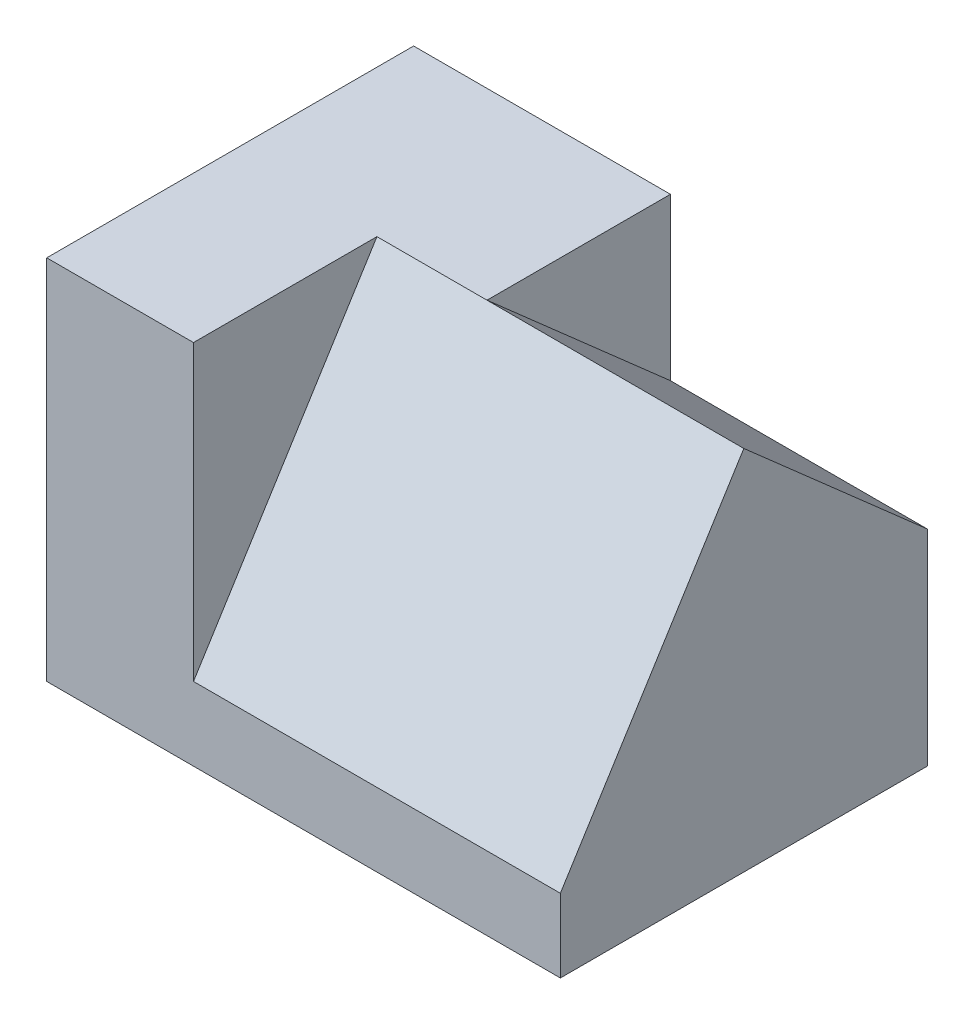
ISO-10303-21;
HEADER;
FILE_DESCRIPTION(('STEP AP214'),'2;1');
FILE_NAME('part.step','',(''),(''),'','','');
FILE_SCHEMA(('AUTOMOTIVE_DESIGN { 1 0 10303 214 1 1 1 1 }'));
ENDSEC;
DATA;
#1=APPLICATION_CONTEXT('core data for automotive mechanical design processes');
#2=APPLICATION_PROTOCOL_DEFINITION('international standard','automotive_design',2000,#1);
#3=PRODUCT_CONTEXT('',#1,'mechanical');
#4=PRODUCT('Part','Part','',(#3));
#5=PRODUCT_RELATED_PRODUCT_CATEGORY('part','',(#4));
#6=PRODUCT_DEFINITION_FORMATION('','',#4);
#7=PRODUCT_DEFINITION_CONTEXT('part definition',#1,'design');
#8=PRODUCT_DEFINITION('design','',#6,#7);
#9=PRODUCT_DEFINITION_SHAPE('','',#8);
#10=(LENGTH_UNIT() NAMED_UNIT(*) SI_UNIT(.MILLI.,.METRE.));
#11=(NAMED_UNIT(*) PLANE_ANGLE_UNIT() SI_UNIT($,.RADIAN.));
#12=(NAMED_UNIT(*) SI_UNIT($,.STERADIAN.) SOLID_ANGLE_UNIT());
#13=UNCERTAINTY_MEASURE_WITH_UNIT(LENGTH_MEASURE(1.E-05),#10,'distance_accuracy_value','');
#14=(GEOMETRIC_REPRESENTATION_CONTEXT(3) GLOBAL_UNCERTAINTY_ASSIGNED_CONTEXT((#13)) GLOBAL_UNIT_ASSIGNED_CONTEXT((#10,
#11,#12)) REPRESENTATION_CONTEXT('',''));
#15=CARTESIAN_POINT('',(0.,0.,0.));
#16=DIRECTION('',(0.,0.,1.));
#17=DIRECTION('',(1.,0.,0.));
#18=AXIS2_PLACEMENT_3D('',#15,#16,#17);
#19=CARTESIAN_POINT('',(70.,10.,0.));
#20=DIRECTION('',(-1.,0.,0.));
#21=DIRECTION('',(0.,0.,1.));
#22=AXIS2_PLACEMENT_3D('',#19,#20,#21);
#23=PLANE('',#22);
#24=DIRECTION('',(0.,0.660627894892025,0.750713516922755));
#25=VECTOR('',#24,1.);
#26=CARTESIAN_POINT('',(70.,50.,-25.));
#27=LINE('',#26,#25);
#28=CARTESIAN_POINT('',(70.,28.,-50.));
#29=VERTEX_POINT('',#28);
#30=CARTESIAN_POINT('',(70.,50.,-25.));
#31=VERTEX_POINT('',#30);
#32=EDGE_CURVE('E111',#29,#31,#27,.T.);
#33=ORIENTED_EDGE('',*,*,#32,.T.);
#34=DIRECTION('',(0.,0.847998304005088,-0.52999894000318));
#35=VECTOR('',#34,1.);
#36=CARTESIAN_POINT('',(70.,50.,-25.));
#37=LINE('',#36,#35);
#38=CARTESIAN_POINT('',(70.,10.,0.));
#39=VERTEX_POINT('',#38);
#40=EDGE_CURVE('E123',#39,#31,#37,.T.);
#41=ORIENTED_EDGE('',*,*,#40,.F.);
#42=DIRECTION('',(0.,-1.,0.));
#43=VECTOR('',#42,1.);
#44=CARTESIAN_POINT('',(70.,10.,0.));
#45=LINE('',#44,#43);
#46=CARTESIAN_POINT('',(70.,0.,0.));
#47=VERTEX_POINT('',#46);
#48=EDGE_CURVE('E175',#39,#47,#45,.T.);
#49=ORIENTED_EDGE('',*,*,#48,.T.);
#50=DIRECTION('',(0.,0.,-1.));
#51=VECTOR('',#50,1.);
#52=CARTESIAN_POINT('',(70.,0.,0.));
#53=LINE('',#52,#51);
#54=CARTESIAN_POINT('',(70.,0.,-50.));
#55=VERTEX_POINT('',#54);
#56=EDGE_CURVE('E165',#47,#55,#53,.T.);
#57=ORIENTED_EDGE('',*,*,#56,.T.);
#58=DIRECTION('',(0.,-1.,0.));
#59=VECTOR('',#58,1.);
#60=CARTESIAN_POINT('',(70.,10.,-50.));
#61=LINE('',#60,#59);
#62=EDGE_CURVE('E125',#29,#55,#61,.T.);
#63=ORIENTED_EDGE('',*,*,#62,.F.);
#64=EDGE_LOOP('',(#33,#41,#49,#57,#63));
#65=FACE_BOUND('',#64,.T.);
#66=ADVANCED_FACE('F47',(#65),#23,.F.);
#67=CARTESIAN_POINT('',(0.,10.,0.));
#68=DIRECTION('',(1.,0.,0.));
#69=DIRECTION('',(0.,0.,-1.));
#70=AXIS2_PLACEMENT_3D('',#67,#68,#69);
#71=PLANE('',#70);
#72=DIRECTION('',(0.,0.,1.));
#73=VECTOR('',#72,1.);
#74=CARTESIAN_POINT('',(0.,0.,0.));
#75=LINE('',#74,#73);
#76=CARTESIAN_POINT('',(0.,0.,-50.));
#77=VERTEX_POINT('',#76);
#78=CARTESIAN_POINT('',(0.,0.,0.));
#79=VERTEX_POINT('',#78);
#80=EDGE_CURVE('E154',#77,#79,#75,.T.);
#81=ORIENTED_EDGE('',*,*,#80,.T.);
#82=DIRECTION('',(0.,-1.,0.));
#83=VECTOR('',#82,1.);
#84=CARTESIAN_POINT('',(0.,10.,0.));
#85=LINE('',#84,#83);
#86=CARTESIAN_POINT('',(0.,50.,0.));
#87=VERTEX_POINT('',#86);
#88=EDGE_CURVE('E56',#87,#79,#85,.T.);
#89=ORIENTED_EDGE('',*,*,#88,.F.);
#90=DIRECTION('',(0.,0.,1.));
#91=VECTOR('',#90,1.);
#92=CARTESIAN_POINT('',(0.,50.,0.));
#93=LINE('',#92,#91);
#94=CARTESIAN_POINT('',(0.,50.,-50.));
#95=VERTEX_POINT('',#94);
#96=EDGE_CURVE('E136',#95,#87,#93,.T.);
#97=ORIENTED_EDGE('',*,*,#96,.F.);
#98=DIRECTION('',(0.,-1.,0.));
#99=VECTOR('',#98,1.);
#100=CARTESIAN_POINT('',(0.,10.,-50.));
#101=LINE('',#100,#99);
#102=EDGE_CURVE('E157',#95,#77,#101,.T.);
#103=ORIENTED_EDGE('',*,*,#102,.T.);
#104=EDGE_LOOP('',(#81,#89,#97,#103));
#105=FACE_BOUND('',#104,.T.);
#106=ADVANCED_FACE('F49',(#105),#71,.F.);
#107=CARTESIAN_POINT('',(0.,10.,0.));
#108=DIRECTION('',(0.,0.,-1.));
#109=DIRECTION('',(-1.,0.,0.));
#110=AXIS2_PLACEMENT_3D('',#107,#108,#109);
#111=PLANE('',#110);
#112=DIRECTION('',(1.,0.,0.));
#113=VECTOR('',#112,1.);
#114=CARTESIAN_POINT('',(0.,0.,0.));
#115=LINE('',#114,#113);
#116=EDGE_CURVE('E162',#79,#47,#115,.T.);
#117=ORIENTED_EDGE('',*,*,#116,.T.);
#118=ORIENTED_EDGE('',*,*,#48,.F.);
#119=DIRECTION('',(1.,0.,0.));
#120=VECTOR('',#119,1.);
#121=CARTESIAN_POINT('',(0.,10.,0.));
#122=LINE('',#121,#120);
#123=CARTESIAN_POINT('',(20.,10.,0.));
#124=VERTEX_POINT('',#123);
#125=EDGE_CURVE('E70',#124,#39,#122,.T.);
#126=ORIENTED_EDGE('',*,*,#125,.F.);
#127=DIRECTION('',(0.,-1.,0.));
#128=VECTOR('',#127,1.);
#129=CARTESIAN_POINT('',(20.,50.,0.));
#130=LINE('',#129,#128);
#131=CARTESIAN_POINT('',(20.,50.,0.));
#132=VERTEX_POINT('',#131);
#133=EDGE_CURVE('E116',#132,#124,#130,.T.);
#134=ORIENTED_EDGE('',*,*,#133,.F.);
#135=DIRECTION('',(1.,0.,0.));
#136=VECTOR('',#135,1.);
#137=CARTESIAN_POINT('',(0.,50.,0.));
#138=LINE('',#137,#136);
#139=EDGE_CURVE('E145',#87,#132,#138,.T.);
#140=ORIENTED_EDGE('',*,*,#139,.F.);
#141=ORIENTED_EDGE('',*,*,#88,.T.);
#142=EDGE_LOOP('',(#117,#118,#126,#134,#140,#141));
#143=FACE_BOUND('',#142,.T.);
#144=ADVANCED_FACE('F180',(#143),#111,.F.);
#145=CARTESIAN_POINT('',(0.,10.,-50.));
#146=DIRECTION('',(0.,0.,1.));
#147=DIRECTION('',(1.,0.,0.));
#148=AXIS2_PLACEMENT_3D('',#145,#146,#147);
#149=PLANE('',#148);
#150=DIRECTION('',(-1.,0.,0.));
#151=VECTOR('',#150,1.);
#152=CARTESIAN_POINT('',(0.,50.,-50.));
#153=LINE('',#152,#151);
#154=CARTESIAN_POINT('',(35.,50.,-50.));
#155=VERTEX_POINT('',#154);
#156=EDGE_CURVE('E131',#155,#95,#153,.T.);
#157=ORIENTED_EDGE('',*,*,#156,.F.);
#158=DIRECTION('',(0.,-1.,0.));
#159=VECTOR('',#158,1.);
#160=CARTESIAN_POINT('',(35.,10.,-50.));
#161=LINE('',#160,#159);
#162=CARTESIAN_POINT('',(35.,28.,-50.));
#163=VERTEX_POINT('',#162);
#164=EDGE_CURVE('E138',#155,#163,#161,.T.);
#165=ORIENTED_EDGE('',*,*,#164,.T.);
#166=DIRECTION('',(-1.,0.,0.));
#167=VECTOR('',#166,1.);
#168=CARTESIAN_POINT('',(0.,28.,-50.));
#169=LINE('',#168,#167);
#170=EDGE_CURVE('E193',#29,#163,#169,.T.);
#171=ORIENTED_EDGE('',*,*,#170,.F.);
#172=ORIENTED_EDGE('',*,*,#62,.T.);
#173=DIRECTION('',(-1.,0.,0.));
#174=VECTOR('',#173,1.);
#175=CARTESIAN_POINT('',(0.,0.,-50.));
#176=LINE('',#175,#174);
#177=EDGE_CURVE('E158',#55,#77,#176,.T.);
#178=ORIENTED_EDGE('',*,*,#177,.T.);
#179=ORIENTED_EDGE('',*,*,#102,.F.);
#180=EDGE_LOOP('',(#157,#165,#171,#172,#178,#179));
#181=FACE_BOUND('',#180,.T.);
#182=ADVANCED_FACE('F191',(#181),#149,.F.);
#183=CARTESIAN_POINT('',(0.,0.,0.));
#184=DIRECTION('',(0.,-1.,0.));
#185=DIRECTION('',(0.,0.,-1.));
#186=AXIS2_PLACEMENT_3D('',#183,#184,#185);
#187=PLANE('',#186);
#188=ORIENTED_EDGE('',*,*,#80,.F.);
#189=ORIENTED_EDGE('',*,*,#177,.F.);
#190=ORIENTED_EDGE('',*,*,#56,.F.);
#191=ORIENTED_EDGE('',*,*,#116,.F.);
#192=EDGE_LOOP('',(#188,#189,#190,#191));
#193=FACE_BOUND('',#192,.T.);
#194=ADVANCED_FACE('F187',(#193),#187,.T.);
#195=CARTESIAN_POINT('',(20.,50.,0.));
#196=DIRECTION('',(-1.,0.,0.));
#197=DIRECTION('',(0.,0.,1.));
#198=AXIS2_PLACEMENT_3D('',#195,#196,#197);
#199=PLANE('',#198);
#200=ORIENTED_EDGE('',*,*,#133,.T.);
#201=DIRECTION('',(0.,-0.847998304005088,0.52999894000318));
#202=VECTOR('',#201,1.);
#203=CARTESIAN_POINT('',(20.,50.,-25.));
#204=LINE('',#203,#202);
#205=CARTESIAN_POINT('',(20.,50.,-25.));
#206=VERTEX_POINT('',#205);
#207=EDGE_CURVE('E132',#206,#124,#204,.T.);
#208=ORIENTED_EDGE('',*,*,#207,.F.);
#209=DIRECTION('',(0.,0.,-1.));
#210=VECTOR('',#209,1.);
#211=CARTESIAN_POINT('',(20.,50.,0.));
#212=LINE('',#211,#210);
#213=EDGE_CURVE('E148',#132,#206,#212,.T.);
#214=ORIENTED_EDGE('',*,*,#213,.F.);
#215=EDGE_LOOP('',(#200,#208,#214));
#216=FACE_BOUND('',#215,.T.);
#217=ADVANCED_FACE('F209',(#216),#199,.F.);
#218=CARTESIAN_POINT('',(0.,50.,0.));
#219=DIRECTION('',(0.,1.,0.));
#220=DIRECTION('',(0.,0.,1.));
#221=AXIS2_PLACEMENT_3D('',#218,#219,#220);
#222=PLANE('',#221);
#223=DIRECTION('',(0.,0.,1.));
#224=VECTOR('',#223,1.);
#225=CARTESIAN_POINT('',(35.,50.,0.));
#226=LINE('',#225,#224);
#227=CARTESIAN_POINT('',(35.,50.,-25.));
#228=VERTEX_POINT('',#227);
#229=EDGE_CURVE('E11',#155,#228,#226,.T.);
#230=ORIENTED_EDGE('',*,*,#229,.F.);
#231=ORIENTED_EDGE('',*,*,#156,.T.);
#232=ORIENTED_EDGE('',*,*,#96,.T.);
#233=ORIENTED_EDGE('',*,*,#139,.T.);
#234=ORIENTED_EDGE('',*,*,#213,.T.);
#235=DIRECTION('',(-1.,0.,0.));
#236=VECTOR('',#235,1.);
#237=CARTESIAN_POINT('',(0.,50.,-25.));
#238=LINE('',#237,#236);
#239=EDGE_CURVE('E117',#228,#206,#238,.T.);
#240=ORIENTED_EDGE('',*,*,#239,.F.);
#241=EDGE_LOOP('',(#230,#231,#232,#233,#234,#240));
#242=FACE_BOUND('',#241,.T.);
#243=ADVANCED_FACE('F204',(#242),#222,.T.);
#244=CARTESIAN_POINT('',(0.,2.80898876404494,4.49438202247191));
#245=DIRECTION('',(0.,0.52999894000318,0.847998304005088));
#246=DIRECTION('',(0.,-0.847998304005088,0.52999894000318));
#247=AXIS2_PLACEMENT_3D('',#244,#245,#246);
#248=PLANE('',#247);
#249=ORIENTED_EDGE('',*,*,#207,.T.);
#250=ORIENTED_EDGE('',*,*,#125,.T.);
#251=ORIENTED_EDGE('',*,*,#40,.T.);
#252=EDGE_CURVE('E108',#31,#228,#238,.T.);
#253=ORIENTED_EDGE('',*,*,#252,.T.);
#254=ORIENTED_EDGE('',*,*,#239,.T.);
#255=EDGE_LOOP('',(#249,#250,#251,#253,#254));
#256=FACE_BOUND('',#255,.T.);
#257=ADVANCED_FACE('F129',(#256),#248,.T.);
#258=CARTESIAN_POINT('',(35.,62.3985572587917,-35.9107303877367));
#259=DIRECTION('',(-1.,0.,0.));
#260=DIRECTION('',(0.,0.,1.));
#261=AXIS2_PLACEMENT_3D('',#258,#259,#260);
#262=PLANE('',#261);
#263=ORIENTED_EDGE('',*,*,#229,.T.);
#264=DIRECTION('',(0.,-0.660627894892025,-0.750713516922755));
#265=VECTOR('',#264,1.);
#266=CARTESIAN_POINT('',(35.,50.,-25.));
#267=LINE('',#266,#265);
#268=EDGE_CURVE('E63',#228,#163,#267,.T.);
#269=ORIENTED_EDGE('',*,*,#268,.T.);
#270=ORIENTED_EDGE('',*,*,#164,.F.);
#271=EDGE_LOOP('',(#263,#269,#270));
#272=FACE_BOUND('',#271,.T.);
#273=ADVANCED_FACE('F200',(#272),#262,.F.);
#274=CARTESIAN_POINT('',(0.,40.5770964833183,-35.7078449053201));
#275=DIRECTION('',(0.,0.750713516922755,-0.660627894892025));
#276=DIRECTION('',(0.,0.660627894892025,0.750713516922755));
#277=AXIS2_PLACEMENT_3D('',#274,#275,#276);
#278=PLANE('',#277);
#279=ORIENTED_EDGE('',*,*,#170,.T.);
#280=ORIENTED_EDGE('',*,*,#268,.F.);
#281=ORIENTED_EDGE('',*,*,#252,.F.);
#282=ORIENTED_EDGE('',*,*,#32,.F.);
#283=EDGE_LOOP('',(#279,#280,#281,#282));
#284=FACE_BOUND('',#283,.T.);
#285=ADVANCED_FACE('F110',(#284),#278,.T.);
#286=CLOSED_SHELL('',(#66,#106,#144,#182,#194,#217,#243,#257,#273,#285));
#287=MANIFOLD_SOLID_BREP('B2',#286);
#288=ADVANCED_BREP_SHAPE_REPRESENTATION('',(#18,#287),#14);
#289=SHAPE_DEFINITION_REPRESENTATION(#9,#288);
ENDSEC;
END-ISO-10303-21;
